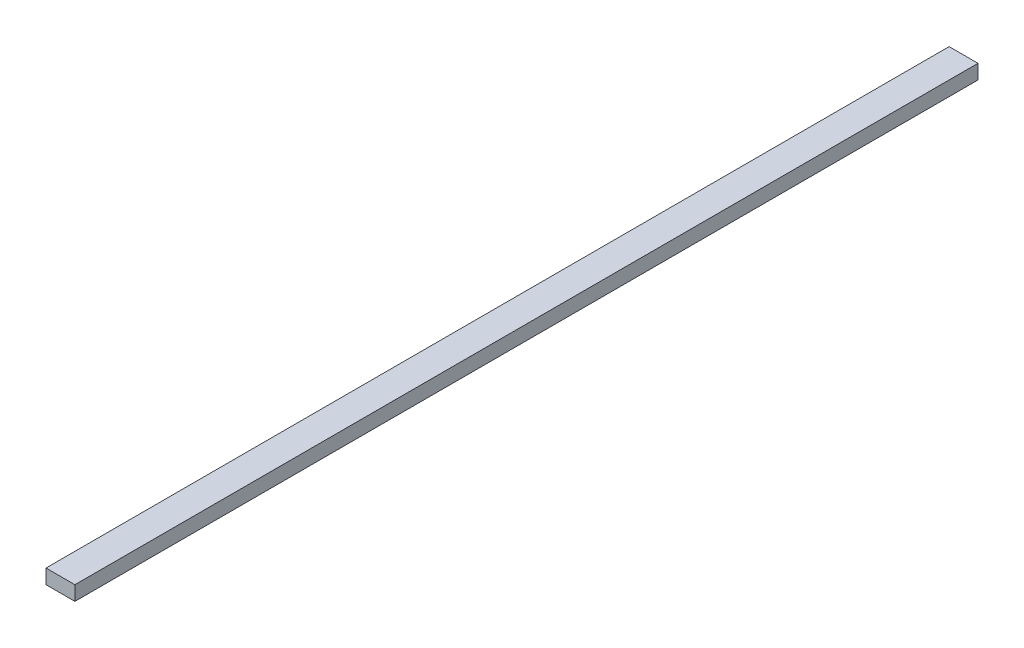
ISO-10303-21;
HEADER;
FILE_DESCRIPTION(('STEP AP214'),'2;1');
FILE_NAME('part.step','',(''),(''),'','','');
FILE_SCHEMA(('AUTOMOTIVE_DESIGN { 1 0 10303 214 1 1 1 1 }'));
ENDSEC;
DATA;
#1=APPLICATION_CONTEXT('core data for automotive mechanical design processes');
#2=APPLICATION_PROTOCOL_DEFINITION('international standard','automotive_design',2000,#1);
#3=PRODUCT_CONTEXT('',#1,'mechanical');
#4=PRODUCT('Part','Part','',(#3));
#5=PRODUCT_RELATED_PRODUCT_CATEGORY('part','',(#4));
#6=PRODUCT_DEFINITION_FORMATION('','',#4);
#7=PRODUCT_DEFINITION_CONTEXT('part definition',#1,'design');
#8=PRODUCT_DEFINITION('design','',#6,#7);
#9=PRODUCT_DEFINITION_SHAPE('','',#8);
#10=(LENGTH_UNIT() NAMED_UNIT(*) SI_UNIT(.MILLI.,.METRE.));
#11=(NAMED_UNIT(*) PLANE_ANGLE_UNIT() SI_UNIT($,.RADIAN.));
#12=(NAMED_UNIT(*) SI_UNIT($,.STERADIAN.) SOLID_ANGLE_UNIT());
#13=UNCERTAINTY_MEASURE_WITH_UNIT(LENGTH_MEASURE(1.E-05),#10,'distance_accuracy_value','');
#14=(GEOMETRIC_REPRESENTATION_CONTEXT(3) GLOBAL_UNCERTAINTY_ASSIGNED_CONTEXT((#13)) GLOBAL_UNIT_ASSIGNED_CONTEXT((#10,
#11,#12)) REPRESENTATION_CONTEXT('',''));
#15=CARTESIAN_POINT('',(0.,0.,0.));
#16=DIRECTION('',(0.,0.,1.));
#17=DIRECTION('',(1.,0.,0.));
#18=AXIS2_PLACEMENT_3D('',#15,#16,#17);
#19=CARTESIAN_POINT('',(20.,10.,1250.));
#20=DIRECTION('',(-1.,0.,0.));
#21=DIRECTION('',(0.,0.,1.));
#22=AXIS2_PLACEMENT_3D('',#19,#20,#21);
#23=PLANE('',#22);
#24=DIRECTION('',(0.,1.,0.));
#25=VECTOR('',#24,1.);
#26=CARTESIAN_POINT('',(20.,10.,0.));
#27=LINE('',#26,#25);
#28=CARTESIAN_POINT('',(20.,-10.,0.));
#29=VERTEX_POINT('',#28);
#30=CARTESIAN_POINT('',(20.,10.,0.));
#31=VERTEX_POINT('',#30);
#32=EDGE_CURVE('E100',#29,#31,#27,.T.);
#33=ORIENTED_EDGE('',*,*,#32,.T.);
#34=DIRECTION('',(0.,0.,-1.));
#35=VECTOR('',#34,1.);
#36=CARTESIAN_POINT('',(20.,10.,1250.));
#37=LINE('',#36,#35);
#38=CARTESIAN_POINT('',(20.,10.,1250.));
#39=VERTEX_POINT('',#38);
#40=EDGE_CURVE('E11',#39,#31,#37,.T.);
#41=ORIENTED_EDGE('',*,*,#40,.F.);
#42=DIRECTION('',(0.,1.,0.));
#43=VECTOR('',#42,1.);
#44=CARTESIAN_POINT('',(20.,10.,1250.));
#45=LINE('',#44,#43);
#46=CARTESIAN_POINT('',(20.,-10.,1250.));
#47=VERTEX_POINT('',#46);
#48=EDGE_CURVE('E88',#47,#39,#45,.T.);
#49=ORIENTED_EDGE('',*,*,#48,.F.);
#50=DIRECTION('',(0.,0.,-1.));
#51=VECTOR('',#50,1.);
#52=CARTESIAN_POINT('',(20.,-10.,1250.));
#53=LINE('',#52,#51);
#54=EDGE_CURVE('E96',#47,#29,#53,.T.);
#55=ORIENTED_EDGE('',*,*,#54,.T.);
#56=EDGE_LOOP('',(#33,#41,#49,#55));
#57=FACE_BOUND('',#56,.T.);
#58=ADVANCED_FACE('F37',(#57),#23,.F.);
#59=CARTESIAN_POINT('',(-20.,10.,1250.));
#60=DIRECTION('',(0.,-1.,0.));
#61=DIRECTION('',(0.,0.,-1.));
#62=AXIS2_PLACEMENT_3D('',#59,#60,#61);
#63=PLANE('',#62);
#64=DIRECTION('',(-1.,0.,0.));
#65=VECTOR('',#64,1.);
#66=CARTESIAN_POINT('',(-20.,10.,0.));
#67=LINE('',#66,#65);
#68=CARTESIAN_POINT('',(-20.,10.,0.));
#69=VERTEX_POINT('',#68);
#70=EDGE_CURVE('E92',#31,#69,#67,.T.);
#71=ORIENTED_EDGE('',*,*,#70,.T.);
#72=DIRECTION('',(0.,0.,-1.));
#73=VECTOR('',#72,1.);
#74=CARTESIAN_POINT('',(-20.,10.,1250.));
#75=LINE('',#74,#73);
#76=CARTESIAN_POINT('',(-20.,10.,1250.));
#77=VERTEX_POINT('',#76);
#78=EDGE_CURVE('E45',#77,#69,#75,.T.);
#79=ORIENTED_EDGE('',*,*,#78,.F.);
#80=DIRECTION('',(-1.,0.,0.));
#81=VECTOR('',#80,1.);
#82=CARTESIAN_POINT('',(-20.,10.,1250.));
#83=LINE('',#82,#81);
#84=EDGE_CURVE('E83',#39,#77,#83,.T.);
#85=ORIENTED_EDGE('',*,*,#84,.F.);
#86=ORIENTED_EDGE('',*,*,#40,.T.);
#87=EDGE_LOOP('',(#71,#79,#85,#86));
#88=FACE_BOUND('',#87,.T.);
#89=ADVANCED_FACE('F91',(#88),#63,.F.);
#90=CARTESIAN_POINT('',(-20.,10.,1250.));
#91=DIRECTION('',(1.,0.,0.));
#92=DIRECTION('',(0.,1.,0.));
#93=AXIS2_PLACEMENT_3D('',#90,#91,#92);
#94=PLANE('',#93);
#95=DIRECTION('',(0.,-1.,0.));
#96=VECTOR('',#95,1.);
#97=CARTESIAN_POINT('',(-20.,10.,0.));
#98=LINE('',#97,#96);
#99=CARTESIAN_POINT('',(-20.,-10.,0.));
#100=VERTEX_POINT('',#99);
#101=EDGE_CURVE('E70',#69,#100,#98,.T.);
#102=ORIENTED_EDGE('',*,*,#101,.T.);
#103=DIRECTION('',(0.,0.,-1.));
#104=VECTOR('',#103,1.);
#105=CARTESIAN_POINT('',(-20.,-10.,1250.));
#106=LINE('',#105,#104);
#107=CARTESIAN_POINT('',(-20.,-10.,1250.));
#108=VERTEX_POINT('',#107);
#109=EDGE_CURVE('E93',#108,#100,#106,.T.);
#110=ORIENTED_EDGE('',*,*,#109,.F.);
#111=DIRECTION('',(0.,-1.,0.));
#112=VECTOR('',#111,1.);
#113=CARTESIAN_POINT('',(-20.,10.,1250.));
#114=LINE('',#113,#112);
#115=EDGE_CURVE('E86',#77,#108,#114,.T.);
#116=ORIENTED_EDGE('',*,*,#115,.F.);
#117=ORIENTED_EDGE('',*,*,#78,.T.);
#118=EDGE_LOOP('',(#102,#110,#116,#117));
#119=FACE_BOUND('',#118,.T.);
#120=ADVANCED_FACE('F94',(#119),#94,.F.);
#121=CARTESIAN_POINT('',(-20.,-10.,1250.));
#122=DIRECTION('',(0.,1.,0.));
#123=DIRECTION('',(0.,0.,1.));
#124=AXIS2_PLACEMENT_3D('',#121,#122,#123);
#125=PLANE('',#124);
#126=DIRECTION('',(1.,0.,0.));
#127=VECTOR('',#126,1.);
#128=CARTESIAN_POINT('',(-20.,-10.,0.));
#129=LINE('',#128,#127);
#130=EDGE_CURVE('E76',#100,#29,#129,.T.);
#131=ORIENTED_EDGE('',*,*,#130,.T.);
#132=ORIENTED_EDGE('',*,*,#54,.F.);
#133=DIRECTION('',(1.,0.,0.));
#134=VECTOR('',#133,1.);
#135=CARTESIAN_POINT('',(-20.,-10.,1250.));
#136=LINE('',#135,#134);
#137=EDGE_CURVE('E53',#108,#47,#136,.T.);
#138=ORIENTED_EDGE('',*,*,#137,.F.);
#139=ORIENTED_EDGE('',*,*,#109,.T.);
#140=EDGE_LOOP('',(#131,#132,#138,#139));
#141=FACE_BOUND('',#140,.T.);
#142=ADVANCED_FACE('F107',(#141),#125,.F.);
#143=CARTESIAN_POINT('',(0.,0.,1250.));
#144=DIRECTION('',(0.,0.,1.));
#145=DIRECTION('',(1.,0.,0.));
#146=AXIS2_PLACEMENT_3D('',#143,#144,#145);
#147=PLANE('',#146);
#148=ORIENTED_EDGE('',*,*,#48,.T.);
#149=ORIENTED_EDGE('',*,*,#84,.T.);
#150=ORIENTED_EDGE('',*,*,#115,.T.);
#151=ORIENTED_EDGE('',*,*,#137,.T.);
#152=EDGE_LOOP('',(#148,#149,#150,#151));
#153=FACE_BOUND('',#152,.T.);
#154=ADVANCED_FACE('F84',(#153),#147,.T.);
#155=CARTESIAN_POINT('',(0.,0.,0.));
#156=DIRECTION('',(0.,0.,1.));
#157=DIRECTION('',(1.,0.,0.));
#158=AXIS2_PLACEMENT_3D('',#155,#156,#157);
#159=PLANE('',#158);
#160=ORIENTED_EDGE('',*,*,#32,.F.);
#161=ORIENTED_EDGE('',*,*,#130,.F.);
#162=ORIENTED_EDGE('',*,*,#101,.F.);
#163=ORIENTED_EDGE('',*,*,#70,.F.);
#164=EDGE_LOOP('',(#160,#161,#162,#163));
#165=FACE_BOUND('',#164,.T.);
#166=ADVANCED_FACE('F110',(#165),#159,.F.);
#167=CLOSED_SHELL('',(#58,#89,#120,#142,#154,#166));
#168=MANIFOLD_SOLID_BREP('B2',#167);
#169=ADVANCED_BREP_SHAPE_REPRESENTATION('',(#18,#168),#14);
#170=SHAPE_DEFINITION_REPRESENTATION(#9,#169);
ENDSEC;
END-ISO-10303-21;
